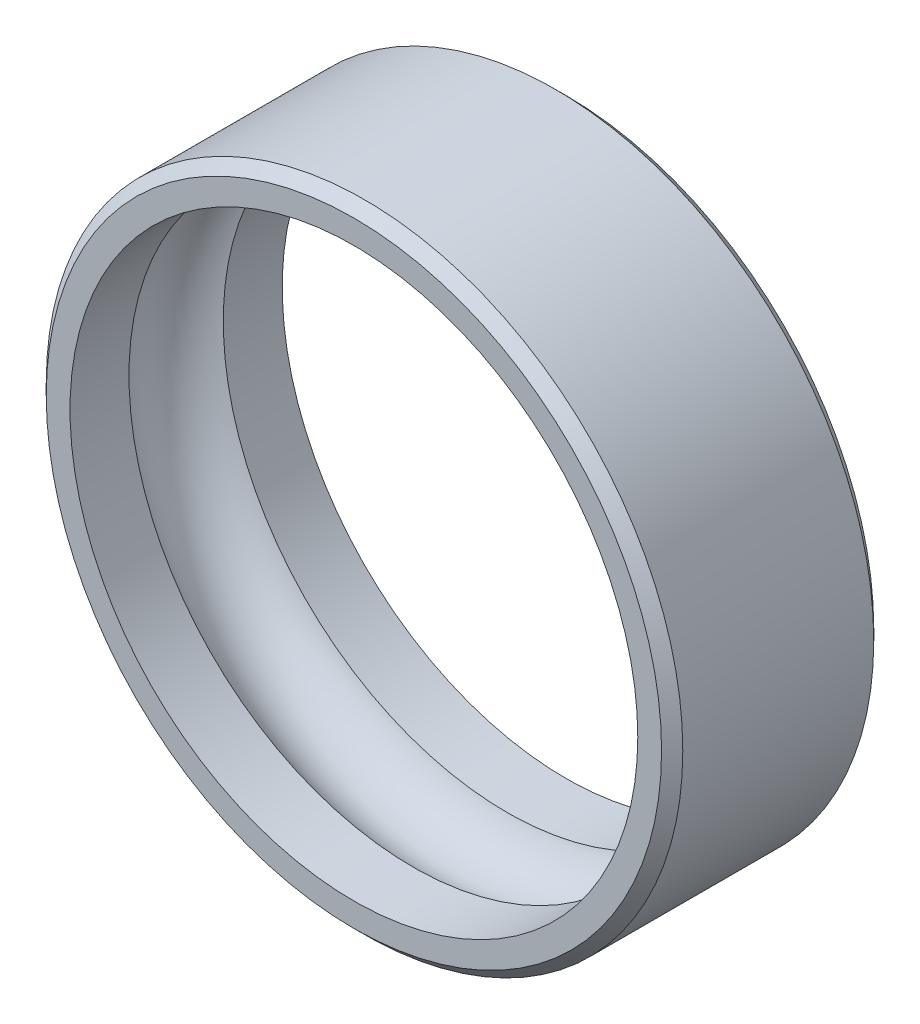
ISO-10303-21;
HEADER;
FILE_DESCRIPTION(('STEP AP214'),'2;1');
FILE_NAME('part.step','',(''),(''),'','','');
FILE_SCHEMA(('AUTOMOTIVE_DESIGN { 1 0 10303 214 1 1 1 1 }'));
ENDSEC;
DATA;
#1=APPLICATION_CONTEXT('core data for automotive mechanical design processes');
#2=APPLICATION_PROTOCOL_DEFINITION('international standard','automotive_design',2000,#1);
#3=PRODUCT_CONTEXT('',#1,'mechanical');
#4=PRODUCT('Part','Part','',(#3));
#5=PRODUCT_RELATED_PRODUCT_CATEGORY('part','',(#4));
#6=PRODUCT_DEFINITION_FORMATION('','',#4);
#7=PRODUCT_DEFINITION_CONTEXT('part definition',#1,'design');
#8=PRODUCT_DEFINITION('design','',#6,#7);
#9=PRODUCT_DEFINITION_SHAPE('','',#8);
#10=(LENGTH_UNIT() NAMED_UNIT(*) SI_UNIT(.MILLI.,.METRE.));
#11=(NAMED_UNIT(*) PLANE_ANGLE_UNIT() SI_UNIT($,.RADIAN.));
#12=(NAMED_UNIT(*) SI_UNIT($,.STERADIAN.) SOLID_ANGLE_UNIT());
#13=UNCERTAINTY_MEASURE_WITH_UNIT(LENGTH_MEASURE(1.E-05),#10,'distance_accuracy_value','');
#14=(GEOMETRIC_REPRESENTATION_CONTEXT(3) GLOBAL_UNCERTAINTY_ASSIGNED_CONTEXT((#13)) GLOBAL_UNIT_ASSIGNED_CONTEXT((#10,
#11,#12)) REPRESENTATION_CONTEXT('',''));
#15=CARTESIAN_POINT('',(0.,0.,0.));
#16=DIRECTION('',(0.,0.,1.));
#17=DIRECTION('',(1.,0.,0.));
#18=AXIS2_PLACEMENT_3D('',#15,#16,#17);
#19=CARTESIAN_POINT('',(4.60375000000113,0.,-1.58750000008355));
#20=DIRECTION('',(0.,0.,-1.));
#21=DIRECTION('',(-1.,0.,0.));
#22=AXIS2_PLACEMENT_3D('',#19,#20,#21);
#23=PLANE('',#22);
#24=CARTESIAN_POINT('',(0.,0.,-1.58750000008355));
#25=DIRECTION('',(0.,0.,1.));
#26=DIRECTION('',(1.,0.,0.));
#27=AXIS2_PLACEMENT_3D('',#24,#25,#26);
#28=CIRCLE('',#27,4.24787087912088);
#29=CARTESIAN_POINT('',(4.24787087912088,0.,-1.58750000008355));
#30=VERTEX_POINT('',#29);
#31=EDGE_CURVE('E64',#30,#30,#28,.T.);
#32=ORIENTED_EDGE('',*,*,#31,.T.);
#33=EDGE_LOOP('',(#32));
#34=FACE_BOUND('',#33,.T.);
#35=CARTESIAN_POINT('',(0.,0.,-1.58750000008355));
#36=DIRECTION('',(0.,0.,1.));
#37=DIRECTION('',(1.,0.,0.));
#38=AXIS2_PLACEMENT_3D('',#35,#36,#37);
#39=CIRCLE('',#38,4.60375000000113);
#40=CARTESIAN_POINT('',(4.60375000000113,0.,-1.58750000008355));
#41=VERTEX_POINT('',#40);
#42=EDGE_CURVE('E10',#41,#41,#39,.T.);
#43=ORIENTED_EDGE('',*,*,#42,.F.);
#44=EDGE_LOOP('',(#43));
#45=FACE_BOUND('',#44,.T.);
#46=ADVANCED_FACE('F36',(#34,#45),#23,.T.);
#47=CARTESIAN_POINT('',(0.,0.,-1.42875000004177));
#48=DIRECTION('',(0.,0.,1.));
#49=DIRECTION('',(1.,0.,0.));
#50=AXIS2_PLACEMENT_3D('',#47,#48,#49);
#51=CONICAL_SURFACE('',#50,4.7625000000429,0.785398163397448);
#52=ORIENTED_EDGE('',*,*,#42,.T.);
#53=EDGE_LOOP('',(#52));
#54=FACE_BOUND('',#53,.T.);
#55=CARTESIAN_POINT('',(0.,0.,-1.42875000004177));
#56=DIRECTION('',(0.,0.,1.));
#57=DIRECTION('',(1.,0.,0.));
#58=AXIS2_PLACEMENT_3D('',#55,#56,#57);
#59=CIRCLE('',#58,4.7625000000429);
#60=CARTESIAN_POINT('',(4.7625000000429,0.,-1.42875000004177));
#61=VERTEX_POINT('',#60);
#62=EDGE_CURVE('E42',#61,#61,#59,.T.);
#63=ORIENTED_EDGE('',*,*,#62,.F.);
#64=EDGE_LOOP('',(#63));
#65=FACE_BOUND('',#64,.T.);
#66=ADVANCED_FACE('F82',(#54,#65),#51,.T.);
#67=CARTESIAN_POINT('',(0.,0.,-1.58750000008467));
#68=DIRECTION('',(0.,0.,1.));
#69=DIRECTION('',(1.,0.,0.));
#70=AXIS2_PLACEMENT_3D('',#67,#68,#69);
#71=CYLINDRICAL_SURFACE('',#70,4.7625000000429);
#72=ORIENTED_EDGE('',*,*,#62,.T.);
#73=EDGE_LOOP('',(#72));
#74=FACE_BOUND('',#73,.T.);
#75=CARTESIAN_POINT('',(0.,0.,1.42874999995823));
#76=DIRECTION('',(0.,0.,1.));
#77=DIRECTION('',(1.,0.,0.));
#78=AXIS2_PLACEMENT_3D('',#75,#76,#77);
#79=CIRCLE('',#78,4.7625000000429);
#80=CARTESIAN_POINT('',(4.7625000000429,0.,1.42874999995823));
#81=VERTEX_POINT('',#80);
#82=EDGE_CURVE('E46',#81,#81,#79,.T.);
#83=ORIENTED_EDGE('',*,*,#82,.F.);
#84=EDGE_LOOP('',(#83));
#85=FACE_BOUND('',#84,.T.);
#86=ADVANCED_FACE('F86',(#74,#85),#71,.T.);
#87=CARTESIAN_POINT('',(0.,0.,1.5875));
#88=DIRECTION('',(0.,0.,-1.));
#89=DIRECTION('',(-1.,0.,0.));
#90=AXIS2_PLACEMENT_3D('',#87,#88,#89);
#91=CONICAL_SURFACE('',#90,4.60375000000113,0.78539816339745);
#92=ORIENTED_EDGE('',*,*,#82,.T.);
#93=EDGE_LOOP('',(#92));
#94=FACE_BOUND('',#93,.T.);
#95=CARTESIAN_POINT('',(0.,0.,1.5875));
#96=DIRECTION('',(0.,0.,1.));
#97=DIRECTION('',(1.,0.,0.));
#98=AXIS2_PLACEMENT_3D('',#95,#96,#97);
#99=CIRCLE('',#98,4.60375000000113);
#100=CARTESIAN_POINT('',(4.60375000000113,0.,1.5875));
#101=VERTEX_POINT('',#100);
#102=EDGE_CURVE('E50',#101,#101,#99,.T.);
#103=ORIENTED_EDGE('',*,*,#102,.F.);
#104=EDGE_LOOP('',(#103));
#105=FACE_BOUND('',#104,.T.);
#106=ADVANCED_FACE('F90',(#94,#105),#91,.T.);
#107=CARTESIAN_POINT('',(4.24787087912088,0.,1.5875));
#108=DIRECTION('',(0.,0.,1.));
#109=DIRECTION('',(1.,0.,0.));
#110=AXIS2_PLACEMENT_3D('',#107,#108,#109);
#111=PLANE('',#110);
#112=ORIENTED_EDGE('',*,*,#102,.T.);
#113=EDGE_LOOP('',(#112));
#114=FACE_BOUND('',#113,.T.);
#115=CARTESIAN_POINT('',(0.,0.,1.5875));
#116=DIRECTION('',(0.,0.,1.));
#117=DIRECTION('',(1.,0.,0.));
#118=AXIS2_PLACEMENT_3D('',#115,#116,#117);
#119=CIRCLE('',#118,4.24787087912088);
#120=CARTESIAN_POINT('',(4.24787087912088,0.,1.5875));
#121=VERTEX_POINT('',#120);
#122=EDGE_CURVE('E55',#121,#121,#119,.T.);
#123=ORIENTED_EDGE('',*,*,#122,.F.);
#124=EDGE_LOOP('',(#123));
#125=FACE_BOUND('',#124,.T.);
#126=ADVANCED_FACE('F96',(#114,#125),#111,.T.);
#127=CARTESIAN_POINT('',(0.,0.,-1.58750000008467));
#128=DIRECTION('',(0.,0.,1.));
#129=DIRECTION('',(1.,0.,0.));
#130=AXIS2_PLACEMENT_3D('',#127,#128,#129);
#131=CYLINDRICAL_SURFACE('',#130,4.24787087912088);
#132=ORIENTED_EDGE('',*,*,#122,.T.);
#133=EDGE_LOOP('',(#132));
#134=FACE_BOUND('',#133,.T.);
#135=CARTESIAN_POINT('',(0.,0.,0.705555555555556));
#136=DIRECTION('',(0.,0.,1.));
#137=DIRECTION('',(1.,0.,0.));
#138=AXIS2_PLACEMENT_3D('',#135,#136,#137);
#139=CIRCLE('',#138,4.24787087912088);
#140=CARTESIAN_POINT('',(4.24787087912088,0.,0.705555555555556));
#141=VERTEX_POINT('',#140);
#142=EDGE_CURVE('E58',#141,#141,#139,.T.);
#143=ORIENTED_EDGE('',*,*,#142,.F.);
#144=EDGE_LOOP('',(#143));
#145=FACE_BOUND('',#144,.T.);
#146=ADVANCED_FACE('F78',(#134,#145),#131,.F.);
#147=CARTESIAN_POINT('',(0.,0.,0.));
#148=DIRECTION('',(0.,0.,1.));
#149=DIRECTION('',(1.,0.,0.));
#150=AXIS2_PLACEMENT_3D('',#147,#148,#149);
#151=TOROIDAL_SURFACE('',#150,3.96875,0.758760243513404);
#152=ORIENTED_EDGE('',*,*,#142,.T.);
#153=EDGE_LOOP('',(#152));
#154=FACE_BOUND('',#153,.T.);
#155=CARTESIAN_POINT('',(0.,0.,-0.705555555555556));
#156=DIRECTION('',(0.,0.,1.));
#157=DIRECTION('',(1.,0.,0.));
#158=AXIS2_PLACEMENT_3D('',#155,#156,#157);
#159=CIRCLE('',#158,4.24787087912088);
#160=CARTESIAN_POINT('',(4.24787087912088,0.,-0.705555555555556));
#161=VERTEX_POINT('',#160);
#162=EDGE_CURVE('E61',#161,#161,#159,.T.);
#163=ORIENTED_EDGE('',*,*,#162,.F.);
#164=EDGE_LOOP('',(#163));
#165=FACE_BOUND('',#164,.T.);
#166=ADVANCED_FACE('F72',(#154,#165),#151,.F.);
#167=CARTESIAN_POINT('',(0.,0.,-1.58750000008467));
#168=DIRECTION('',(0.,0.,1.));
#169=DIRECTION('',(1.,0.,0.));
#170=AXIS2_PLACEMENT_3D('',#167,#168,#169);
#171=CYLINDRICAL_SURFACE('',#170,4.24787087912088);
#172=ORIENTED_EDGE('',*,*,#162,.T.);
#173=EDGE_LOOP('',(#172));
#174=FACE_BOUND('',#173,.T.);
#175=ORIENTED_EDGE('',*,*,#31,.F.);
#176=EDGE_LOOP('',(#175));
#177=FACE_BOUND('',#176,.T.);
#178=ADVANCED_FACE('F70',(#174,#177),#171,.F.);
#179=CLOSED_SHELL('',(#46,#66,#86,#106,#126,#146,#166,#178));
#180=MANIFOLD_SOLID_BREP('B2',#179);
#181=ADVANCED_BREP_SHAPE_REPRESENTATION('',(#18,#180),#14);
#182=SHAPE_DEFINITION_REPRESENTATION(#9,#181);
ENDSEC;
END-ISO-10303-21;
